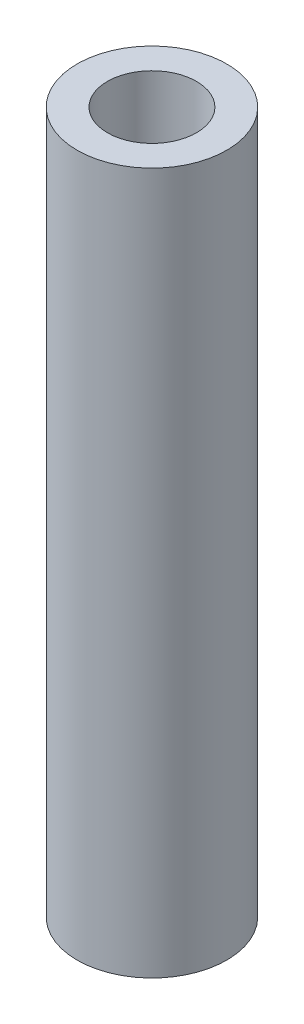
ISO-10303-21;
HEADER;
FILE_DESCRIPTION(('STEP AP214'),'2;1');
FILE_NAME('part.step','',(''),(''),'','','');
FILE_SCHEMA(('AUTOMOTIVE_DESIGN { 1 0 10303 214 1 1 1 1 }'));
ENDSEC;
DATA;
#1=APPLICATION_CONTEXT('core data for automotive mechanical design processes');
#2=APPLICATION_PROTOCOL_DEFINITION('international standard','automotive_design',2000,#1);
#3=PRODUCT_CONTEXT('',#1,'mechanical');
#4=PRODUCT('Part','Part','',(#3));
#5=PRODUCT_RELATED_PRODUCT_CATEGORY('part','',(#4));
#6=PRODUCT_DEFINITION_FORMATION('','',#4);
#7=PRODUCT_DEFINITION_CONTEXT('part definition',#1,'design');
#8=PRODUCT_DEFINITION('design','',#6,#7);
#9=PRODUCT_DEFINITION_SHAPE('','',#8);
#10=(LENGTH_UNIT() NAMED_UNIT(*) SI_UNIT(.MILLI.,.METRE.));
#11=(NAMED_UNIT(*) PLANE_ANGLE_UNIT() SI_UNIT($,.RADIAN.));
#12=(NAMED_UNIT(*) SI_UNIT($,.STERADIAN.) SOLID_ANGLE_UNIT());
#13=UNCERTAINTY_MEASURE_WITH_UNIT(LENGTH_MEASURE(1.E-05),#10,'distance_accuracy_value','');
#14=(GEOMETRIC_REPRESENTATION_CONTEXT(3) GLOBAL_UNCERTAINTY_ASSIGNED_CONTEXT((#13)) GLOBAL_UNIT_ASSIGNED_CONTEXT((#10,
#11,#12)) REPRESENTATION_CONTEXT('',''));
#15=CARTESIAN_POINT('',(0.,0.,0.));
#16=DIRECTION('',(0.,0.,1.));
#17=DIRECTION('',(1.,0.,0.));
#18=AXIS2_PLACEMENT_3D('',#15,#16,#17);
#19=CARTESIAN_POINT('',(0.,37.5,0.));
#20=DIRECTION('',(0.,-1.,0.));
#21=DIRECTION('',(0.,0.,-1.));
#22=AXIS2_PLACEMENT_3D('',#19,#20,#21);
#23=CYLINDRICAL_SURFACE('',#22,4.);
#24=CARTESIAN_POINT('',(0.,37.5,0.));
#25=DIRECTION('',(0.,1.,0.));
#26=DIRECTION('',(0.,0.,1.));
#27=AXIS2_PLACEMENT_3D('',#24,#25,#26);
#28=CIRCLE('',#27,4.);
#29=CARTESIAN_POINT('',(0.,37.5,4.));
#30=VERTEX_POINT('',#29);
#31=EDGE_CURVE('E11',#30,#30,#28,.T.);
#32=ORIENTED_EDGE('',*,*,#31,.F.);
#33=EDGE_LOOP('',(#32));
#34=FACE_BOUND('',#33,.T.);
#35=CARTESIAN_POINT('',(0.,0.,0.));
#36=DIRECTION('',(0.,1.,0.));
#37=DIRECTION('',(0.,0.,1.));
#38=AXIS2_PLACEMENT_3D('',#35,#36,#37);
#39=CIRCLE('',#38,4.);
#40=CARTESIAN_POINT('',(0.,0.,4.));
#41=VERTEX_POINT('',#40);
#42=EDGE_CURVE('E39',#41,#41,#39,.T.);
#43=ORIENTED_EDGE('',*,*,#42,.T.);
#44=EDGE_LOOP('',(#43));
#45=FACE_BOUND('',#44,.T.);
#46=ADVANCED_FACE('F36',(#34,#45),#23,.T.);
#47=CARTESIAN_POINT('',(0.,37.5,0.));
#48=DIRECTION('',(0.,1.,0.));
#49=DIRECTION('',(0.,0.,1.));
#50=AXIS2_PLACEMENT_3D('',#47,#48,#49);
#51=PLANE('',#50);
#52=CARTESIAN_POINT('',(0.,37.5,0.));
#53=DIRECTION('',(0.,1.,0.));
#54=DIRECTION('',(0.,0.,1.));
#55=AXIS2_PLACEMENT_3D('',#52,#53,#54);
#56=CIRCLE('',#55,2.38125);
#57=CARTESIAN_POINT('',(0.,37.5,2.38125));
#58=VERTEX_POINT('',#57);
#59=EDGE_CURVE('E53',#58,#58,#56,.T.);
#60=ORIENTED_EDGE('',*,*,#59,.F.);
#61=EDGE_LOOP('',(#60));
#62=FACE_BOUND('',#61,.T.);
#63=ORIENTED_EDGE('',*,*,#31,.T.);
#64=EDGE_LOOP('',(#63));
#65=FACE_BOUND('',#64,.T.);
#66=ADVANCED_FACE('F69',(#62,#65),#51,.T.);
#67=CARTESIAN_POINT('',(0.,0.,0.));
#68=DIRECTION('',(0.,1.,0.));
#69=DIRECTION('',(0.,0.,1.));
#70=AXIS2_PLACEMENT_3D('',#67,#68,#69);
#71=PLANE('',#70);
#72=CARTESIAN_POINT('',(0.,0.,0.));
#73=DIRECTION('',(0.,-1.,0.));
#74=DIRECTION('',(0.,0.,-1.));
#75=AXIS2_PLACEMENT_3D('',#72,#73,#74);
#76=CIRCLE('',#75,2.38125);
#77=CARTESIAN_POINT('',(0.,0.,-2.38125));
#78=VERTEX_POINT('',#77);
#79=EDGE_CURVE('E46',#78,#78,#76,.T.);
#80=ORIENTED_EDGE('',*,*,#79,.F.);
#81=EDGE_LOOP('',(#80));
#82=FACE_BOUND('',#81,.T.);
#83=ORIENTED_EDGE('',*,*,#42,.F.);
#84=EDGE_LOOP('',(#83));
#85=FACE_BOUND('',#84,.T.);
#86=ADVANCED_FACE('F71',(#82,#85),#71,.F.);
#87=CARTESIAN_POINT('',(0.,0.,0.));
#88=DIRECTION('',(0.,-1.,0.));
#89=DIRECTION('',(0.,0.,-1.));
#90=AXIS2_PLACEMENT_3D('',#87,#88,#89);
#91=CYLINDRICAL_SURFACE('',#90,2.38125);
#92=CARTESIAN_POINT('',(0.,15.,0.));
#93=DIRECTION('',(0.,-1.,0.));
#94=DIRECTION('',(0.,0.,-1.));
#95=AXIS2_PLACEMENT_3D('',#92,#93,#94);
#96=CIRCLE('',#95,2.38125);
#97=CARTESIAN_POINT('',(0.,15.,-2.38125));
#98=VERTEX_POINT('',#97);
#99=EDGE_CURVE('E50',#98,#98,#96,.T.);
#100=ORIENTED_EDGE('',*,*,#99,.F.);
#101=EDGE_LOOP('',(#100));
#102=FACE_BOUND('',#101,.T.);
#103=ORIENTED_EDGE('',*,*,#79,.T.);
#104=EDGE_LOOP('',(#103));
#105=FACE_BOUND('',#104,.T.);
#106=ADVANCED_FACE('F77',(#102,#105),#91,.F.);
#107=CARTESIAN_POINT('',(2.38125,15.,0.));
#108=DIRECTION('',(0.,1.,0.));
#109=DIRECTION('',(0.,0.,1.));
#110=AXIS2_PLACEMENT_3D('',#107,#108,#109);
#111=PLANE('',#110);
#112=ORIENTED_EDGE('',*,*,#99,.T.);
#113=EDGE_LOOP('',(#112));
#114=FACE_BOUND('',#113,.T.);
#115=ADVANCED_FACE('F65',(#114),#111,.F.);
#116=CARTESIAN_POINT('',(0.,37.5,0.));
#117=DIRECTION('',(0.,1.,0.));
#118=DIRECTION('',(0.,0.,1.));
#119=AXIS2_PLACEMENT_3D('',#116,#117,#118);
#120=CYLINDRICAL_SURFACE('',#119,2.38125);
#121=CARTESIAN_POINT('',(0.,22.5,0.));
#122=DIRECTION('',(0.,1.,0.));
#123=DIRECTION('',(0.,0.,1.));
#124=AXIS2_PLACEMENT_3D('',#121,#122,#123);
#125=CIRCLE('',#124,2.38125);
#126=CARTESIAN_POINT('',(0.,22.5,2.38125));
#127=VERTEX_POINT('',#126);
#128=EDGE_CURVE('E56',#127,#127,#125,.T.);
#129=ORIENTED_EDGE('',*,*,#128,.F.);
#130=EDGE_LOOP('',(#129));
#131=FACE_BOUND('',#130,.T.);
#132=ORIENTED_EDGE('',*,*,#59,.T.);
#133=EDGE_LOOP('',(#132));
#134=FACE_BOUND('',#133,.T.);
#135=ADVANCED_FACE('F62',(#131,#134),#120,.F.);
#136=CARTESIAN_POINT('',(2.38125,22.5,0.));
#137=DIRECTION('',(0.,-1.,0.));
#138=DIRECTION('',(0.,0.,-1.));
#139=AXIS2_PLACEMENT_3D('',#136,#137,#138);
#140=PLANE('',#139);
#141=ORIENTED_EDGE('',*,*,#128,.T.);
#142=EDGE_LOOP('',(#141));
#143=FACE_BOUND('',#142,.T.);
#144=ADVANCED_FACE('F60',(#143),#140,.F.);
#145=CLOSED_SHELL('',(#46,#66,#86,#106,#115,#135,#144));
#146=MANIFOLD_SOLID_BREP('B2',#145);
#147=ADVANCED_BREP_SHAPE_REPRESENTATION('',(#18,#146),#14);
#148=SHAPE_DEFINITION_REPRESENTATION(#9,#147);
ENDSEC;
END-ISO-10303-21;
